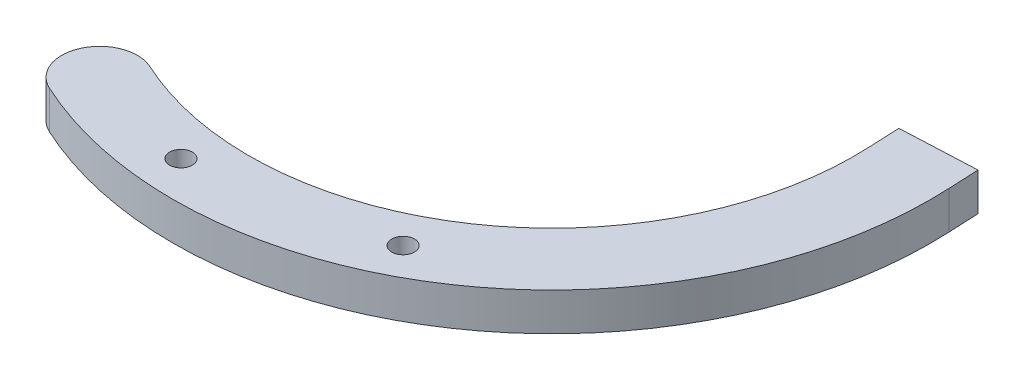
ISO-10303-21;
HEADER;
FILE_DESCRIPTION(('STEP AP214'),'2;1');
FILE_NAME('part.step','',(''),(''),'','','');
FILE_SCHEMA(('AUTOMOTIVE_DESIGN { 1 0 10303 214 1 1 1 1 }'));
ENDSEC;
DATA;
#1=APPLICATION_CONTEXT('core data for automotive mechanical design processes');
#2=APPLICATION_PROTOCOL_DEFINITION('international standard','automotive_design',2000,#1);
#3=PRODUCT_CONTEXT('',#1,'mechanical');
#4=PRODUCT('Part','Part','',(#3));
#5=PRODUCT_RELATED_PRODUCT_CATEGORY('part','',(#4));
#6=PRODUCT_DEFINITION_FORMATION('','',#4);
#7=PRODUCT_DEFINITION_CONTEXT('part definition',#1,'design');
#8=PRODUCT_DEFINITION('design','',#6,#7);
#9=PRODUCT_DEFINITION_SHAPE('','',#8);
#10=(LENGTH_UNIT() NAMED_UNIT(*) SI_UNIT(.MILLI.,.METRE.));
#11=(NAMED_UNIT(*) PLANE_ANGLE_UNIT() SI_UNIT($,.RADIAN.));
#12=(NAMED_UNIT(*) SI_UNIT($,.STERADIAN.) SOLID_ANGLE_UNIT());
#13=UNCERTAINTY_MEASURE_WITH_UNIT(LENGTH_MEASURE(1.E-05),#10,'distance_accuracy_value','');
#14=(GEOMETRIC_REPRESENTATION_CONTEXT(3) GLOBAL_UNCERTAINTY_ASSIGNED_CONTEXT((#13)) GLOBAL_UNIT_ASSIGNED_CONTEXT((#10,
#11,#12)) REPRESENTATION_CONTEXT('',''));
#15=CARTESIAN_POINT('',(0.,0.,0.));
#16=DIRECTION('',(0.,0.,1.));
#17=DIRECTION('',(1.,0.,0.));
#18=AXIS2_PLACEMENT_3D('',#15,#16,#17);
#19=CARTESIAN_POINT('',(2.25579232948525,5.,9.30013161079132));
#20=DIRECTION('',(0.,-1.,0.));
#21=DIRECTION('',(0.,0.,-1.));
#22=AXIS2_PLACEMENT_3D('',#19,#20,#21);
#23=CYLINDRICAL_SURFACE('',#22,5.);
#24=CARTESIAN_POINT('',(2.25579232948525,0.,9.30013161079132));
#25=DIRECTION('',(0.,1.,0.));
#26=DIRECTION('',(0.,0.,1.));
#27=AXIS2_PLACEMENT_3D('',#24,#25,#26);
#28=CIRCLE('',#27,5.);
#29=CARTESIAN_POINT('',(4.34663921270161,0.,4.7582862467411));
#30=VERTEX_POINT('',#29);
#31=CARTESIAN_POINT('',(0.164945446268869,0.,13.8419769748415));
#32=VERTEX_POINT('',#31);
#33=EDGE_CURVE('E132',#30,#32,#28,.T.);
#34=ORIENTED_EDGE('',*,*,#33,.T.);
#35=DIRECTION('',(0.,-1.,0.));
#36=VECTOR('',#35,1.);
#37=CARTESIAN_POINT('',(0.164945446268869,5.,13.8419769748415));
#38=LINE('',#37,#36);
#39=CARTESIAN_POINT('',(0.164945446268869,5.,13.8419769748415));
#40=VERTEX_POINT('',#39);
#41=EDGE_CURVE('E11',#40,#32,#38,.T.);
#42=ORIENTED_EDGE('',*,*,#41,.F.);
#43=CARTESIAN_POINT('',(2.25579232948525,5.,9.30013161079132));
#44=DIRECTION('',(0.,1.,0.));
#45=DIRECTION('',(0.,0.,1.));
#46=AXIS2_PLACEMENT_3D('',#43,#44,#45);
#47=CIRCLE('',#46,5.);
#48=CARTESIAN_POINT('',(4.34663921270161,5.,4.7582862467411));
#49=VERTEX_POINT('',#48);
#50=EDGE_CURVE('E145',#49,#40,#47,.T.);
#51=ORIENTED_EDGE('',*,*,#50,.F.);
#52=DIRECTION('',(0.,-1.,0.));
#53=VECTOR('',#52,1.);
#54=CARTESIAN_POINT('',(4.34663921270161,5.,4.7582862467411));
#55=LINE('',#54,#53);
#56=EDGE_CURVE('E63',#49,#30,#55,.T.);
#57=ORIENTED_EDGE('',*,*,#56,.T.);
#58=EDGE_LOOP('',(#34,#42,#51,#57));
#59=FACE_BOUND('',#58,.T.);
#60=ADVANCED_FACE('F47',(#59),#23,.T.);
#61=CARTESIAN_POINT('',(21.0734142784327,5.,-31.5764766656605));
#62=DIRECTION('',(0.,-1.,0.));
#63=DIRECTION('',(0.,0.,-1.));
#64=AXIS2_PLACEMENT_3D('',#61,#62,#63);
#65=CYLINDRICAL_SURFACE('',#64,50.);
#66=CARTESIAN_POINT('',(21.0734142784327,0.,-31.5764766656605));
#67=DIRECTION('',(0.,1.,0.));
#68=DIRECTION('',(0.,0.,1.));
#69=AXIS2_PLACEMENT_3D('',#66,#67,#68);
#70=CIRCLE('',#69,50.);
#71=CARTESIAN_POINT('',(71.0113295060892,0.,-34.067384675884));
#72=VERTEX_POINT('',#71);
#73=EDGE_CURVE('E134',#32,#72,#70,.T.);
#74=ORIENTED_EDGE('',*,*,#73,.T.);
#75=DIRECTION('',(0.,-1.,0.));
#76=VECTOR('',#75,1.);
#77=CARTESIAN_POINT('',(71.0113295060892,5.,-34.067384675884));
#78=LINE('',#77,#76);
#79=CARTESIAN_POINT('',(71.0113295060892,5.,-34.067384675884));
#80=VERTEX_POINT('',#79);
#81=EDGE_CURVE('E55',#80,#72,#78,.T.);
#82=ORIENTED_EDGE('',*,*,#81,.F.);
#83=CARTESIAN_POINT('',(21.0734142784327,5.,-31.5764766656605));
#84=DIRECTION('',(0.,1.,0.));
#85=DIRECTION('',(0.,0.,1.));
#86=AXIS2_PLACEMENT_3D('',#83,#84,#85);
#87=CIRCLE('',#86,50.);
#88=EDGE_CURVE('E95',#40,#80,#87,.T.);
#89=ORIENTED_EDGE('',*,*,#88,.F.);
#90=ORIENTED_EDGE('',*,*,#41,.T.);
#91=EDGE_LOOP('',(#74,#82,#89,#90));
#92=FACE_BOUND('',#91,.T.);
#93=ADVANCED_FACE('F167',(#92),#65,.T.);
#94=CARTESIAN_POINT('',(72.4334703782302,5.,-3.35392348288566));
#95=DIRECTION('',(-0.998929713485438,0.,0.0462539459495232));
#96=DIRECTION('',(0.0462539459495232,0.,0.998929713485438));
#97=AXIS2_PLACEMENT_3D('',#94,#95,#96);
#98=PLANE('',#97);
#99=DIRECTION('',(-0.0462539459495232,0.,-0.998929713485438));
#100=VECTOR('',#99,1.);
#101=CARTESIAN_POINT('',(72.4334703782302,0.,-3.35392348288566));
#102=LINE('',#101,#100);
#103=CARTESIAN_POINT('',(70.8263137222911,0.,-38.0631035298258));
#104=VERTEX_POINT('',#103);
#105=EDGE_CURVE('E137',#72,#104,#102,.T.);
#106=ORIENTED_EDGE('',*,*,#105,.T.);
#107=DIRECTION('',(0.,-1.,0.));
#108=VECTOR('',#107,1.);
#109=CARTESIAN_POINT('',(70.8263137222911,5.,-38.0631035298258));
#110=LINE('',#109,#108);
#111=CARTESIAN_POINT('',(70.8263137222911,5.,-38.0631035298258));
#112=VERTEX_POINT('',#111);
#113=EDGE_CURVE('E124',#112,#104,#110,.T.);
#114=ORIENTED_EDGE('',*,*,#113,.F.);
#115=DIRECTION('',(-0.0462539459495232,0.,-0.998929713485438));
#116=VECTOR('',#115,1.);
#117=CARTESIAN_POINT('',(72.4334703782302,5.,-3.35392348288566));
#118=LINE('',#117,#116);
#119=EDGE_CURVE('E112',#80,#112,#118,.T.);
#120=ORIENTED_EDGE('',*,*,#119,.F.);
#121=ORIENTED_EDGE('',*,*,#81,.T.);
#122=EDGE_LOOP('',(#106,#114,#120,#121));
#123=FACE_BOUND('',#122,.T.);
#124=ADVANCED_FACE('F151',(#123),#98,.F.);
#125=CARTESIAN_POINT('',(-1.60715665593909,5.,-34.7091800469401));
#126=DIRECTION('',(0.0462539459495237,0.,0.998929713485437));
#127=DIRECTION('',(0.998929713485438,0.,-0.0462539459495237));
#128=AXIS2_PLACEMENT_3D('',#125,#126,#127);
#129=PLANE('',#128);
#130=DIRECTION('',(-0.998929713485438,0.,0.0462539459495238));
#131=VECTOR('',#130,1.);
#132=CARTESIAN_POINT('',(-1.60715665593909,0.,-34.7091800469401));
#133=LINE('',#132,#131);
#134=CARTESIAN_POINT('',(60.8370801843183,0.,-37.600567015089));
#135=VERTEX_POINT('',#134);
#136=EDGE_CURVE('E121',#104,#135,#133,.T.);
#137=ORIENTED_EDGE('',*,*,#136,.T.);
#138=DIRECTION('',(0.,-1.,0.));
#139=VECTOR('',#138,1.);
#140=CARTESIAN_POINT('',(60.8370801843183,5.,-37.600567015089));
#141=LINE('',#140,#139);
#142=CARTESIAN_POINT('',(60.8370801843183,5.,-37.600567015089));
#143=VERTEX_POINT('',#142);
#144=EDGE_CURVE('E118',#143,#135,#141,.T.);
#145=ORIENTED_EDGE('',*,*,#144,.F.);
#146=DIRECTION('',(-0.998929713485438,0.,0.0462539459495238));
#147=VECTOR('',#146,1.);
#148=CARTESIAN_POINT('',(-1.60715665593909,5.,-34.7091800469401));
#149=LINE('',#148,#147);
#150=EDGE_CURVE('E105',#112,#143,#149,.T.);
#151=ORIENTED_EDGE('',*,*,#150,.F.);
#152=ORIENTED_EDGE('',*,*,#113,.T.);
#153=EDGE_LOOP('',(#137,#145,#151,#152));
#154=FACE_BOUND('',#153,.T.);
#155=ADVANCED_FACE('F119',(#154),#129,.F.);
#156=CARTESIAN_POINT('',(62.4442368402574,5.,-2.89138696814901));
#157=DIRECTION('',(-0.998929713485438,0.,0.0462539459495252));
#158=DIRECTION('',(0.0462539459495252,0.,0.998929713485438));
#159=AXIS2_PLACEMENT_3D('',#156,#157,#158);
#160=PLANE('',#159);
#161=DIRECTION('',(-0.0462539459495252,0.,-0.998929713485438));
#162=VECTOR('',#161,1.);
#163=CARTESIAN_POINT('',(62.4442368402574,0.,-2.89138696814901));
#164=LINE('',#163,#162);
#165=CARTESIAN_POINT('',(61.0237464605579,0.,-33.5692030738393));
#166=VERTEX_POINT('',#165);
#167=EDGE_CURVE('E140',#166,#135,#164,.T.);
#168=ORIENTED_EDGE('',*,*,#167,.F.);
#169=DIRECTION('',(0.,-1.,0.));
#170=VECTOR('',#169,1.);
#171=CARTESIAN_POINT('',(61.0237464605579,5.,-33.5692030738393));
#172=LINE('',#171,#170);
#173=CARTESIAN_POINT('',(61.0237464605579,5.,-33.5692030738393));
#174=VERTEX_POINT('',#173);
#175=EDGE_CURVE('E83',#174,#166,#172,.T.);
#176=ORIENTED_EDGE('',*,*,#175,.F.);
#177=DIRECTION('',(-0.0462539459495252,0.,-0.998929713485438));
#178=VECTOR('',#177,1.);
#179=CARTESIAN_POINT('',(62.4442368402574,5.,-2.89138696814901));
#180=LINE('',#179,#178);
#181=EDGE_CURVE('E110',#174,#143,#180,.T.);
#182=ORIENTED_EDGE('',*,*,#181,.T.);
#183=ORIENTED_EDGE('',*,*,#144,.T.);
#184=EDGE_LOOP('',(#168,#176,#182,#183));
#185=FACE_BOUND('',#184,.T.);
#186=ADVANCED_FACE('F126',(#185),#160,.T.);
#187=CARTESIAN_POINT('',(21.0734142784327,5.,-31.5764766656605));
#188=DIRECTION('',(0.,-1.,0.));
#189=DIRECTION('',(0.,0.,-1.));
#190=AXIS2_PLACEMENT_3D('',#187,#188,#189);
#191=CYLINDRICAL_SURFACE('',#190,40.);
#192=CARTESIAN_POINT('',(21.0734142784327,0.,-31.5764766656605));
#193=DIRECTION('',(0.,1.,0.));
#194=DIRECTION('',(0.,0.,1.));
#195=AXIS2_PLACEMENT_3D('',#192,#193,#194);
#196=CIRCLE('',#195,40.);
#197=EDGE_CURVE('E142',#30,#166,#196,.T.);
#198=ORIENTED_EDGE('',*,*,#197,.F.);
#199=ORIENTED_EDGE('',*,*,#56,.F.);
#200=CARTESIAN_POINT('',(21.0734142784327,5.,-31.5764766656605));
#201=DIRECTION('',(0.,1.,0.));
#202=DIRECTION('',(0.,0.,1.));
#203=AXIS2_PLACEMENT_3D('',#200,#201,#202);
#204=CIRCLE('',#203,40.);
#205=EDGE_CURVE('E127',#49,#174,#204,.T.);
#206=ORIENTED_EDGE('',*,*,#205,.T.);
#207=ORIENTED_EDGE('',*,*,#175,.T.);
#208=EDGE_LOOP('',(#198,#199,#206,#207));
#209=FACE_BOUND('',#208,.T.);
#210=ADVANCED_FACE('F154',(#209),#191,.F.);
#211=CARTESIAN_POINT('',(0.,5.,0.));
#212=DIRECTION('',(0.,1.,0.));
#213=DIRECTION('',(0.,0.,1.));
#214=AXIS2_PLACEMENT_3D('',#211,#212,#213);
#215=PLANE('',#214);
#216=CARTESIAN_POINT('',(16.9304138153998,5.,13.2324013292557));
#217=DIRECTION('',(0.,1.,0.));
#218=DIRECTION('',(0.,0.,1.));
#219=AXIS2_PLACEMENT_3D('',#216,#217,#218);
#220=CIRCLE('',#219,1.50000000000001);
#221=CARTESIAN_POINT('',(16.9304138153998,5.,14.7324013292558));
#222=VERTEX_POINT('',#221);
#223=EDGE_CURVE('E178',#222,#222,#220,.T.);
#224=ORIENTED_EDGE('',*,*,#223,.F.);
#225=EDGE_LOOP('',(#224));
#226=FACE_BOUND('',#225,.T.);
#227=CARTESIAN_POINT('',(41.5227859135487,5.,8.50872259452649));
#228=DIRECTION('',(0.,1.,0.));
#229=DIRECTION('',(0.,0.,1.));
#230=AXIS2_PLACEMENT_3D('',#227,#228,#229);
#231=CIRCLE('',#230,1.49999999999999);
#232=CARTESIAN_POINT('',(41.5227859135487,5.,10.0087225945265));
#233=VERTEX_POINT('',#232);
#234=EDGE_CURVE('E175',#233,#233,#231,.T.);
#235=ORIENTED_EDGE('',*,*,#234,.F.);
#236=EDGE_LOOP('',(#235));
#237=FACE_BOUND('',#236,.T.);
#238=ORIENTED_EDGE('',*,*,#50,.T.);
#239=ORIENTED_EDGE('',*,*,#88,.T.);
#240=ORIENTED_EDGE('',*,*,#119,.T.);
#241=ORIENTED_EDGE('',*,*,#150,.T.);
#242=ORIENTED_EDGE('',*,*,#181,.F.);
#243=ORIENTED_EDGE('',*,*,#205,.F.);
#244=EDGE_LOOP('',(#238,#239,#240,#241,#242,#243));
#245=FACE_BOUND('',#244,.T.);
#246=ADVANCED_FACE('F107',(#226,#237,#245),#215,.T.);
#247=CARTESIAN_POINT('',(0.,0.,0.));
#248=DIRECTION('',(0.,1.,0.));
#249=DIRECTION('',(0.,0.,1.));
#250=AXIS2_PLACEMENT_3D('',#247,#248,#249);
#251=PLANE('',#250);
#252=CARTESIAN_POINT('',(16.9304138153998,0.,13.2324013292557));
#253=DIRECTION('',(0.,1.,0.));
#254=DIRECTION('',(0.,0.,1.));
#255=AXIS2_PLACEMENT_3D('',#252,#253,#254);
#256=CIRCLE('',#255,1.50000000000001);
#257=CARTESIAN_POINT('',(16.9304138153998,0.,14.7324013292558));
#258=VERTEX_POINT('',#257);
#259=EDGE_CURVE('E135',#258,#258,#256,.F.);
#260=ORIENTED_EDGE('',*,*,#259,.F.);
#261=EDGE_LOOP('',(#260));
#262=FACE_BOUND('',#261,.T.);
#263=CARTESIAN_POINT('',(41.5227859135487,0.,8.50872259452649));
#264=DIRECTION('',(0.,1.,0.));
#265=DIRECTION('',(0.,0.,1.));
#266=AXIS2_PLACEMENT_3D('',#263,#264,#265);
#267=CIRCLE('',#266,1.49999999999999);
#268=CARTESIAN_POINT('',(41.5227859135487,0.,10.0087225945265));
#269=VERTEX_POINT('',#268);
#270=EDGE_CURVE('E179',#269,#269,#267,.F.);
#271=ORIENTED_EDGE('',*,*,#270,.F.);
#272=EDGE_LOOP('',(#271));
#273=FACE_BOUND('',#272,.T.);
#274=ORIENTED_EDGE('',*,*,#33,.F.);
#275=ORIENTED_EDGE('',*,*,#197,.T.);
#276=ORIENTED_EDGE('',*,*,#167,.T.);
#277=ORIENTED_EDGE('',*,*,#136,.F.);
#278=ORIENTED_EDGE('',*,*,#105,.F.);
#279=ORIENTED_EDGE('',*,*,#73,.F.);
#280=EDGE_LOOP('',(#274,#275,#276,#277,#278,#279));
#281=FACE_BOUND('',#280,.T.);
#282=ADVANCED_FACE('F153',(#262,#273,#281),#251,.F.);
#283=CARTESIAN_POINT('',(41.5227859135487,-0.00100000000000013,8.50872259452649));
#284=DIRECTION('',(0.,1.,0.));
#285=DIRECTION('',(0.,0.,1.));
#286=AXIS2_PLACEMENT_3D('',#283,#284,#285);
#287=CYLINDRICAL_SURFACE('',#286,1.49999999999999);
#288=ORIENTED_EDGE('',*,*,#234,.T.);
#289=EDGE_LOOP('',(#288));
#290=FACE_BOUND('',#289,.T.);
#291=ORIENTED_EDGE('',*,*,#270,.T.);
#292=EDGE_LOOP('',(#291));
#293=FACE_BOUND('',#292,.T.);
#294=ADVANCED_FACE('F192',(#290,#293),#287,.F.);
#295=CARTESIAN_POINT('',(16.9304138153998,-0.00100000000000013,13.2324013292557));
#296=DIRECTION('',(0.,1.,0.));
#297=DIRECTION('',(0.,0.,1.));
#298=AXIS2_PLACEMENT_3D('',#295,#296,#297);
#299=CYLINDRICAL_SURFACE('',#298,1.50000000000001);
#300=ORIENTED_EDGE('',*,*,#223,.T.);
#301=EDGE_LOOP('',(#300));
#302=FACE_BOUND('',#301,.T.);
#303=ORIENTED_EDGE('',*,*,#259,.T.);
#304=EDGE_LOOP('',(#303));
#305=FACE_BOUND('',#304,.T.);
#306=ADVANCED_FACE('F187',(#302,#305),#299,.F.);
#307=CLOSED_SHELL('',(#60,#93,#124,#155,#186,#210,#246,#282,#294,#306));
#308=MANIFOLD_SOLID_BREP('B2',#307);
#309=ADVANCED_BREP_SHAPE_REPRESENTATION('',(#18,#308),#14);
#310=SHAPE_DEFINITION_REPRESENTATION(#9,#309);
ENDSEC;
END-ISO-10303-21;
